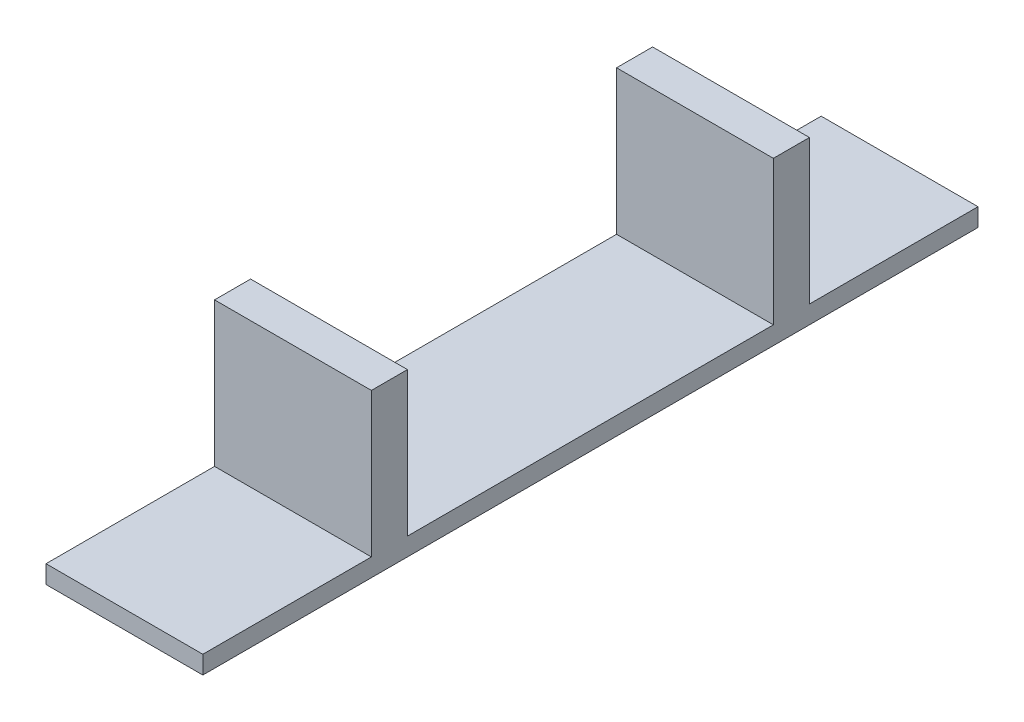
ISO-10303-21;
HEADER;
FILE_DESCRIPTION(('STEP AP214'),'2;1');
FILE_NAME('part.step','',(''),(''),'','','');
FILE_SCHEMA(('AUTOMOTIVE_DESIGN { 1 0 10303 214 1 1 1 1 }'));
ENDSEC;
DATA;
#1=APPLICATION_CONTEXT('core data for automotive mechanical design processes');
#2=APPLICATION_PROTOCOL_DEFINITION('international standard','automotive_design',2000,#1);
#3=PRODUCT_CONTEXT('',#1,'mechanical');
#4=PRODUCT('Part','Part','',(#3));
#5=PRODUCT_RELATED_PRODUCT_CATEGORY('part','',(#4));
#6=PRODUCT_DEFINITION_FORMATION('','',#4);
#7=PRODUCT_DEFINITION_CONTEXT('part definition',#1,'design');
#8=PRODUCT_DEFINITION('design','',#6,#7);
#9=PRODUCT_DEFINITION_SHAPE('','',#8);
#10=(LENGTH_UNIT() NAMED_UNIT(*) SI_UNIT(.MILLI.,.METRE.));
#11=(NAMED_UNIT(*) PLANE_ANGLE_UNIT() SI_UNIT($,.RADIAN.));
#12=(NAMED_UNIT(*) SI_UNIT($,.STERADIAN.) SOLID_ANGLE_UNIT());
#13=UNCERTAINTY_MEASURE_WITH_UNIT(LENGTH_MEASURE(1.E-05),#10,'distance_accuracy_value','');
#14=(GEOMETRIC_REPRESENTATION_CONTEXT(3) GLOBAL_UNCERTAINTY_ASSIGNED_CONTEXT((#13)) GLOBAL_UNIT_ASSIGNED_CONTEXT((#10,
#11,#12)) REPRESENTATION_CONTEXT('',''));
#15=CARTESIAN_POINT('',(0.,0.,0.));
#16=DIRECTION('',(0.,0.,1.));
#17=DIRECTION('',(1.,0.,0.));
#18=AXIS2_PLACEMENT_3D('',#15,#16,#17);
#19=CARTESIAN_POINT('',(0.,1.,0.));
#20=DIRECTION('',(0.,-1.,0.));
#21=DIRECTION('',(0.,0.,-1.));
#22=AXIS2_PLACEMENT_3D('',#19,#20,#21);
#23=PLANE('',#22);
#24=DIRECTION('',(1.,0.,0.));
#25=VECTOR('',#24,1.);
#26=CARTESIAN_POINT('',(-8.7,1.,33.65));
#27=LINE('',#26,#25);
#28=CARTESIAN_POINT('',(-8.7,1.,33.65));
#29=VERTEX_POINT('',#28);
#30=CARTESIAN_POINT('',(0.,1.,33.65));
#31=VERTEX_POINT('',#30);
#32=EDGE_CURVE('E153',#29,#31,#27,.T.);
#33=ORIENTED_EDGE('',*,*,#32,.F.);
#34=DIRECTION('',(0.,0.,1.));
#35=VECTOR('',#34,1.);
#36=CARTESIAN_POINT('',(-8.7,1.,0.));
#37=LINE('',#36,#35);
#38=CARTESIAN_POINT('',(-8.69999999999999,1.,43.));
#39=VERTEX_POINT('',#38);
#40=EDGE_CURVE('E206',#29,#39,#37,.T.);
#41=ORIENTED_EDGE('',*,*,#40,.T.);
#42=DIRECTION('',(1.,0.,0.));
#43=VECTOR('',#42,1.);
#44=CARTESIAN_POINT('',(0.,1.,43.));
#45=LINE('',#44,#43);
#46=CARTESIAN_POINT('',(0.,1.,43.));
#47=VERTEX_POINT('',#46);
#48=EDGE_CURVE('E210',#39,#47,#45,.T.);
#49=ORIENTED_EDGE('',*,*,#48,.T.);
#50=DIRECTION('',(0.,0.,-1.));
#51=VECTOR('',#50,1.);
#52=CARTESIAN_POINT('',(0.,1.,0.));
#53=LINE('',#52,#51);
#54=EDGE_CURVE('E63',#47,#31,#53,.T.);
#55=ORIENTED_EDGE('',*,*,#54,.T.);
#56=EDGE_LOOP('',(#33,#41,#49,#55));
#57=FACE_BOUND('',#56,.T.);
#58=ADVANCED_FACE('F39',(#57),#23,.F.);
#59=DIRECTION('',(-1.,0.,0.));
#60=VECTOR('',#59,1.);
#61=CARTESIAN_POINT('',(-8.7,1.,31.65));
#62=LINE('',#61,#60);
#63=CARTESIAN_POINT('',(0.,1.,31.65));
#64=VERTEX_POINT('',#63);
#65=CARTESIAN_POINT('',(-8.7,1.,31.65));
#66=VERTEX_POINT('',#65);
#67=EDGE_CURVE('E55',#64,#66,#62,.T.);
#68=ORIENTED_EDGE('',*,*,#67,.F.);
#69=CARTESIAN_POINT('',(0.,1.,11.35));
#70=VERTEX_POINT('',#69);
#71=EDGE_CURVE('E202',#64,#70,#53,.T.);
#72=ORIENTED_EDGE('',*,*,#71,.T.);
#73=DIRECTION('',(1.,0.,0.));
#74=VECTOR('',#73,1.);
#75=CARTESIAN_POINT('',(-8.7,1.,11.35));
#76=LINE('',#75,#74);
#77=CARTESIAN_POINT('',(-8.7,1.,11.35));
#78=VERTEX_POINT('',#77);
#79=EDGE_CURVE('E160',#78,#70,#76,.T.);
#80=ORIENTED_EDGE('',*,*,#79,.F.);
#81=EDGE_CURVE('E211',#78,#66,#37,.T.);
#82=ORIENTED_EDGE('',*,*,#81,.T.);
#83=EDGE_LOOP('',(#68,#72,#80,#82));
#84=FACE_BOUND('',#83,.T.);
#85=ADVANCED_FACE('F258',(#84),#23,.F.);
#86=DIRECTION('',(-1.,0.,0.));
#87=VECTOR('',#86,1.);
#88=CARTESIAN_POINT('',(-8.7,1.,9.35));
#89=LINE('',#88,#87);
#90=CARTESIAN_POINT('',(0.,1.,9.35));
#91=VERTEX_POINT('',#90);
#92=CARTESIAN_POINT('',(-8.7,1.,9.35));
#93=VERTEX_POINT('',#92);
#94=EDGE_CURVE('E155',#91,#93,#89,.T.);
#95=ORIENTED_EDGE('',*,*,#94,.F.);
#96=CARTESIAN_POINT('',(0.,1.,0.));
#97=VERTEX_POINT('',#96);
#98=EDGE_CURVE('E203',#91,#97,#53,.T.);
#99=ORIENTED_EDGE('',*,*,#98,.T.);
#100=DIRECTION('',(-1.,0.,0.));
#101=VECTOR('',#100,1.);
#102=CARTESIAN_POINT('',(0.,1.,0.));
#103=LINE('',#102,#101);
#104=CARTESIAN_POINT('',(-8.7,1.,0.));
#105=VERTEX_POINT('',#104);
#106=EDGE_CURVE('E201',#97,#105,#103,.T.);
#107=ORIENTED_EDGE('',*,*,#106,.T.);
#108=EDGE_CURVE('E207',#105,#93,#37,.T.);
#109=ORIENTED_EDGE('',*,*,#108,.T.);
#110=EDGE_LOOP('',(#95,#99,#107,#109));
#111=FACE_BOUND('',#110,.T.);
#112=ADVANCED_FACE('F255',(#111),#23,.F.);
#113=CARTESIAN_POINT('',(0.,1.,0.));
#114=DIRECTION('',(-1.,0.,0.));
#115=DIRECTION('',(0.,0.,1.));
#116=AXIS2_PLACEMENT_3D('',#113,#114,#115);
#117=PLANE('',#116);
#118=DIRECTION('',(0.,0.,-1.));
#119=VECTOR('',#118,1.);
#120=CARTESIAN_POINT('',(0.,0.,0.));
#121=LINE('',#120,#119);
#122=CARTESIAN_POINT('',(0.,0.,43.));
#123=VERTEX_POINT('',#122);
#124=CARTESIAN_POINT('',(0.,0.,0.));
#125=VERTEX_POINT('',#124);
#126=EDGE_CURVE('E198',#123,#125,#121,.T.);
#127=ORIENTED_EDGE('',*,*,#126,.T.);
#128=DIRECTION('',(0.,-1.,0.));
#129=VECTOR('',#128,1.);
#130=CARTESIAN_POINT('',(0.,1.,0.));
#131=LINE('',#130,#129);
#132=EDGE_CURVE('E11',#97,#125,#131,.T.);
#133=ORIENTED_EDGE('',*,*,#132,.F.);
#134=ORIENTED_EDGE('',*,*,#98,.F.);
#135=DIRECTION('',(0.,-1.,0.));
#136=VECTOR('',#135,1.);
#137=CARTESIAN_POINT('',(0.,9.,9.35));
#138=LINE('',#137,#136);
#139=CARTESIAN_POINT('',(0.,9.,9.35));
#140=VERTEX_POINT('',#139);
#141=EDGE_CURVE('E194',#140,#91,#138,.T.);
#142=ORIENTED_EDGE('',*,*,#141,.F.);
#143=DIRECTION('',(0.,0.,-1.));
#144=VECTOR('',#143,1.);
#145=CARTESIAN_POINT('',(0.,9.,9.35));
#146=LINE('',#145,#144);
#147=CARTESIAN_POINT('',(0.,9.,11.35));
#148=VERTEX_POINT('',#147);
#149=EDGE_CURVE('E166',#148,#140,#146,.T.);
#150=ORIENTED_EDGE('',*,*,#149,.F.);
#151=DIRECTION('',(0.,-1.,0.));
#152=VECTOR('',#151,1.);
#153=CARTESIAN_POINT('',(0.,9.,11.35));
#154=LINE('',#153,#152);
#155=EDGE_CURVE('E178',#148,#70,#154,.T.);
#156=ORIENTED_EDGE('',*,*,#155,.T.);
#157=ORIENTED_EDGE('',*,*,#71,.F.);
#158=DIRECTION('',(0.,-1.,0.));
#159=VECTOR('',#158,1.);
#160=CARTESIAN_POINT('',(0.,9.,31.65));
#161=LINE('',#160,#159);
#162=CARTESIAN_POINT('',(0.,9.,31.65));
#163=VERTEX_POINT('',#162);
#164=EDGE_CURVE('E136',#163,#64,#161,.T.);
#165=ORIENTED_EDGE('',*,*,#164,.F.);
#166=DIRECTION('',(0.,0.,-1.));
#167=VECTOR('',#166,1.);
#168=CARTESIAN_POINT('',(0.,9.,33.65));
#169=LINE('',#168,#167);
#170=CARTESIAN_POINT('',(0.,9.,33.65));
#171=VERTEX_POINT('',#170);
#172=EDGE_CURVE('E129',#171,#163,#169,.T.);
#173=ORIENTED_EDGE('',*,*,#172,.F.);
#174=DIRECTION('',(0.,-1.,0.));
#175=VECTOR('',#174,1.);
#176=CARTESIAN_POINT('',(0.,9.,33.65));
#177=LINE('',#176,#175);
#178=EDGE_CURVE('E133',#171,#31,#177,.T.);
#179=ORIENTED_EDGE('',*,*,#178,.T.);
#180=ORIENTED_EDGE('',*,*,#54,.F.);
#181=DIRECTION('',(0.,-1.,0.));
#182=VECTOR('',#181,1.);
#183=CARTESIAN_POINT('',(0.,1.,43.));
#184=LINE('',#183,#182);
#185=EDGE_CURVE('E214',#47,#123,#184,.T.);
#186=ORIENTED_EDGE('',*,*,#185,.T.);
#187=EDGE_LOOP('',(#127,#133,#134,#142,#150,#156,#157,#165,#173,#179,#180,#186));
#188=FACE_BOUND('',#187,.T.);
#189=ADVANCED_FACE('F41',(#188),#117,.F.);
#190=CARTESIAN_POINT('',(0.,1.,0.));
#191=DIRECTION('',(0.,0.,1.));
#192=DIRECTION('',(1.,0.,0.));
#193=AXIS2_PLACEMENT_3D('',#190,#191,#192);
#194=PLANE('',#193);
#195=DIRECTION('',(-1.,0.,0.));
#196=VECTOR('',#195,1.);
#197=CARTESIAN_POINT('',(0.,0.,0.));
#198=LINE('',#197,#196);
#199=CARTESIAN_POINT('',(-8.7,0.,0.));
#200=VERTEX_POINT('',#199);
#201=EDGE_CURVE('E217',#125,#200,#198,.T.);
#202=ORIENTED_EDGE('',*,*,#201,.T.);
#203=DIRECTION('',(0.,-1.,0.));
#204=VECTOR('',#203,1.);
#205=CARTESIAN_POINT('',(-8.7,1.,0.));
#206=LINE('',#205,#204);
#207=EDGE_CURVE('E48',#105,#200,#206,.T.);
#208=ORIENTED_EDGE('',*,*,#207,.F.);
#209=ORIENTED_EDGE('',*,*,#106,.F.);
#210=ORIENTED_EDGE('',*,*,#132,.T.);
#211=EDGE_LOOP('',(#202,#208,#209,#210));
#212=FACE_BOUND('',#211,.T.);
#213=ADVANCED_FACE('F253',(#212),#194,.F.);
#214=CARTESIAN_POINT('',(-8.7,1.,0.));
#215=DIRECTION('',(1.,0.,0.));
#216=DIRECTION('',(0.,0.,-1.));
#217=AXIS2_PLACEMENT_3D('',#214,#215,#216);
#218=PLANE('',#217);
#219=DIRECTION('',(0.,0.,1.));
#220=VECTOR('',#219,1.);
#221=CARTESIAN_POINT('',(-8.7,0.,0.));
#222=LINE('',#221,#220);
#223=CARTESIAN_POINT('',(-8.69999999999999,0.,43.));
#224=VERTEX_POINT('',#223);
#225=EDGE_CURVE('E220',#200,#224,#222,.T.);
#226=ORIENTED_EDGE('',*,*,#225,.T.);
#227=DIRECTION('',(0.,-1.,0.));
#228=VECTOR('',#227,1.);
#229=CARTESIAN_POINT('',(-8.69999999999999,1.,43.));
#230=LINE('',#229,#228);
#231=EDGE_CURVE('E229',#39,#224,#230,.T.);
#232=ORIENTED_EDGE('',*,*,#231,.F.);
#233=ORIENTED_EDGE('',*,*,#40,.F.);
#234=DIRECTION('',(0.,-1.,0.));
#235=VECTOR('',#234,1.);
#236=CARTESIAN_POINT('',(-8.7,9.,33.65));
#237=LINE('',#236,#235);
#238=CARTESIAN_POINT('',(-8.7,9.,33.65));
#239=VERTEX_POINT('',#238);
#240=EDGE_CURVE('E274',#239,#29,#237,.T.);
#241=ORIENTED_EDGE('',*,*,#240,.F.);
#242=DIRECTION('',(0.,0.,1.));
#243=VECTOR('',#242,1.);
#244=CARTESIAN_POINT('',(-8.7,9.,33.65));
#245=LINE('',#244,#243);
#246=CARTESIAN_POINT('',(-8.7,9.,31.65));
#247=VERTEX_POINT('',#246);
#248=EDGE_CURVE('E146',#247,#239,#245,.T.);
#249=ORIENTED_EDGE('',*,*,#248,.F.);
#250=DIRECTION('',(0.,-1.,0.));
#251=VECTOR('',#250,1.);
#252=CARTESIAN_POINT('',(-8.7,9.,31.65));
#253=LINE('',#252,#251);
#254=EDGE_CURVE('E162',#247,#66,#253,.T.);
#255=ORIENTED_EDGE('',*,*,#254,.T.);
#256=ORIENTED_EDGE('',*,*,#81,.F.);
#257=DIRECTION('',(0.,-1.,0.));
#258=VECTOR('',#257,1.);
#259=CARTESIAN_POINT('',(-8.7,9.,11.35));
#260=LINE('',#259,#258);
#261=CARTESIAN_POINT('',(-8.7,9.,11.35));
#262=VERTEX_POINT('',#261);
#263=EDGE_CURVE('E186',#262,#78,#260,.T.);
#264=ORIENTED_EDGE('',*,*,#263,.F.);
#265=DIRECTION('',(0.,0.,1.));
#266=VECTOR('',#265,1.);
#267=CARTESIAN_POINT('',(-8.7,9.,9.35));
#268=LINE('',#267,#266);
#269=CARTESIAN_POINT('',(-8.7,9.,9.35));
#270=VERTEX_POINT('',#269);
#271=EDGE_CURVE('E173',#270,#262,#268,.T.);
#272=ORIENTED_EDGE('',*,*,#271,.F.);
#273=DIRECTION('',(0.,-1.,0.));
#274=VECTOR('',#273,1.);
#275=CARTESIAN_POINT('',(-8.7,9.,9.35));
#276=LINE('',#275,#274);
#277=EDGE_CURVE('E190',#270,#93,#276,.T.);
#278=ORIENTED_EDGE('',*,*,#277,.T.);
#279=ORIENTED_EDGE('',*,*,#108,.F.);
#280=ORIENTED_EDGE('',*,*,#207,.T.);
#281=EDGE_LOOP('',(#226,#232,#233,#241,#249,#255,#256,#264,#272,#278,#279,#280));
#282=FACE_BOUND('',#281,.T.);
#283=ADVANCED_FACE('F238',(#282),#218,.F.);
#284=CARTESIAN_POINT('',(0.,1.,43.));
#285=DIRECTION('',(0.,0.,-1.));
#286=DIRECTION('',(-1.,0.,0.));
#287=AXIS2_PLACEMENT_3D('',#284,#285,#286);
#288=PLANE('',#287);
#289=DIRECTION('',(1.,0.,0.));
#290=VECTOR('',#289,1.);
#291=CARTESIAN_POINT('',(0.,0.,43.));
#292=LINE('',#291,#290);
#293=EDGE_CURVE('E223',#224,#123,#292,.T.);
#294=ORIENTED_EDGE('',*,*,#293,.T.);
#295=ORIENTED_EDGE('',*,*,#185,.F.);
#296=ORIENTED_EDGE('',*,*,#48,.F.);
#297=ORIENTED_EDGE('',*,*,#231,.T.);
#298=EDGE_LOOP('',(#294,#295,#296,#297));
#299=FACE_BOUND('',#298,.T.);
#300=ADVANCED_FACE('F248',(#299),#288,.F.);
#301=CARTESIAN_POINT('',(0.,0.,0.));
#302=DIRECTION('',(0.,-1.,0.));
#303=DIRECTION('',(0.,0.,-1.));
#304=AXIS2_PLACEMENT_3D('',#301,#302,#303);
#305=PLANE('',#304);
#306=ORIENTED_EDGE('',*,*,#126,.F.);
#307=ORIENTED_EDGE('',*,*,#293,.F.);
#308=ORIENTED_EDGE('',*,*,#225,.F.);
#309=ORIENTED_EDGE('',*,*,#201,.F.);
#310=EDGE_LOOP('',(#306,#307,#308,#309));
#311=FACE_BOUND('',#310,.T.);
#312=ADVANCED_FACE('F245',(#311),#305,.T.);
#313=CARTESIAN_POINT('',(-8.7,9.,9.35));
#314=DIRECTION('',(0.,0.,1.));
#315=DIRECTION('',(1.,0.,0.));
#316=AXIS2_PLACEMENT_3D('',#313,#314,#315);
#317=PLANE('',#316);
#318=ORIENTED_EDGE('',*,*,#94,.T.);
#319=ORIENTED_EDGE('',*,*,#277,.F.);
#320=DIRECTION('',(-1.,0.,0.));
#321=VECTOR('',#320,1.);
#322=CARTESIAN_POINT('',(-8.7,9.,9.35));
#323=LINE('',#322,#321);
#324=EDGE_CURVE('E170',#140,#270,#323,.T.);
#325=ORIENTED_EDGE('',*,*,#324,.F.);
#326=ORIENTED_EDGE('',*,*,#141,.T.);
#327=EDGE_LOOP('',(#318,#319,#325,#326));
#328=FACE_BOUND('',#327,.T.);
#329=ADVANCED_FACE('F317',(#328),#317,.F.);
#330=CARTESIAN_POINT('',(-8.7,9.,11.35));
#331=DIRECTION('',(0.,0.,-1.));
#332=DIRECTION('',(-1.,0.,0.));
#333=AXIS2_PLACEMENT_3D('',#330,#331,#332);
#334=PLANE('',#333);
#335=ORIENTED_EDGE('',*,*,#79,.T.);
#336=ORIENTED_EDGE('',*,*,#155,.F.);
#337=DIRECTION('',(1.,0.,0.));
#338=VECTOR('',#337,1.);
#339=CARTESIAN_POINT('',(-8.7,9.,11.35));
#340=LINE('',#339,#338);
#341=EDGE_CURVE('E176',#262,#148,#340,.T.);
#342=ORIENTED_EDGE('',*,*,#341,.F.);
#343=ORIENTED_EDGE('',*,*,#263,.T.);
#344=EDGE_LOOP('',(#335,#336,#342,#343));
#345=FACE_BOUND('',#344,.T.);
#346=ADVANCED_FACE('F262',(#345),#334,.F.);
#347=CARTESIAN_POINT('',(0.,9.,0.));
#348=DIRECTION('',(0.,1.,0.));
#349=DIRECTION('',(0.,0.,1.));
#350=AXIS2_PLACEMENT_3D('',#347,#348,#349);
#351=PLANE('',#350);
#352=ORIENTED_EDGE('',*,*,#149,.T.);
#353=ORIENTED_EDGE('',*,*,#324,.T.);
#354=ORIENTED_EDGE('',*,*,#271,.T.);
#355=ORIENTED_EDGE('',*,*,#341,.T.);
#356=EDGE_LOOP('',(#352,#353,#354,#355));
#357=FACE_BOUND('',#356,.T.);
#358=ADVANCED_FACE('F267',(#357),#351,.T.);
#359=CARTESIAN_POINT('',(-8.7,9.,33.65));
#360=DIRECTION('',(0.,0.,-1.));
#361=DIRECTION('',(-1.,0.,0.));
#362=AXIS2_PLACEMENT_3D('',#359,#360,#361);
#363=PLANE('',#362);
#364=ORIENTED_EDGE('',*,*,#32,.T.);
#365=ORIENTED_EDGE('',*,*,#178,.F.);
#366=DIRECTION('',(1.,0.,0.));
#367=VECTOR('',#366,1.);
#368=CARTESIAN_POINT('',(-8.7,9.,33.65));
#369=LINE('',#368,#367);
#370=EDGE_CURVE('E141',#239,#171,#369,.T.);
#371=ORIENTED_EDGE('',*,*,#370,.F.);
#372=ORIENTED_EDGE('',*,*,#240,.T.);
#373=EDGE_LOOP('',(#364,#365,#371,#372));
#374=FACE_BOUND('',#373,.T.);
#375=ADVANCED_FACE('F152',(#374),#363,.F.);
#376=CARTESIAN_POINT('',(-8.7,9.,31.65));
#377=DIRECTION('',(0.,0.,1.));
#378=DIRECTION('',(1.,0.,0.));
#379=AXIS2_PLACEMENT_3D('',#376,#377,#378);
#380=PLANE('',#379);
#381=ORIENTED_EDGE('',*,*,#67,.T.);
#382=ORIENTED_EDGE('',*,*,#254,.F.);
#383=DIRECTION('',(-1.,0.,0.));
#384=VECTOR('',#383,1.);
#385=CARTESIAN_POINT('',(-8.7,9.,31.65));
#386=LINE('',#385,#384);
#387=EDGE_CURVE('E140',#163,#247,#386,.T.);
#388=ORIENTED_EDGE('',*,*,#387,.F.);
#389=ORIENTED_EDGE('',*,*,#164,.T.);
#390=EDGE_LOOP('',(#381,#382,#388,#389));
#391=FACE_BOUND('',#390,.T.);
#392=ADVANCED_FACE('F287',(#391),#380,.F.);
#393=CARTESIAN_POINT('',(0.,9.,0.));
#394=DIRECTION('',(0.,1.,0.));
#395=DIRECTION('',(0.,0.,1.));
#396=AXIS2_PLACEMENT_3D('',#393,#394,#395);
#397=PLANE('',#396);
#398=ORIENTED_EDGE('',*,*,#370,.T.);
#399=ORIENTED_EDGE('',*,*,#172,.T.);
#400=ORIENTED_EDGE('',*,*,#387,.T.);
#401=ORIENTED_EDGE('',*,*,#248,.T.);
#402=EDGE_LOOP('',(#398,#399,#400,#401));
#403=FACE_BOUND('',#402,.T.);
#404=ADVANCED_FACE('F144',(#403),#397,.T.);
#405=CLOSED_SHELL('',(#58,#85,#112,#189,#213,#283,#300,#312,#329,#346,#358,#375,#392,#404));
#406=MANIFOLD_SOLID_BREP('B2',#405);
#407=ADVANCED_BREP_SHAPE_REPRESENTATION('',(#18,#406),#14);
#408=SHAPE_DEFINITION_REPRESENTATION(#9,#407);
ENDSEC;
END-ISO-10303-21;
